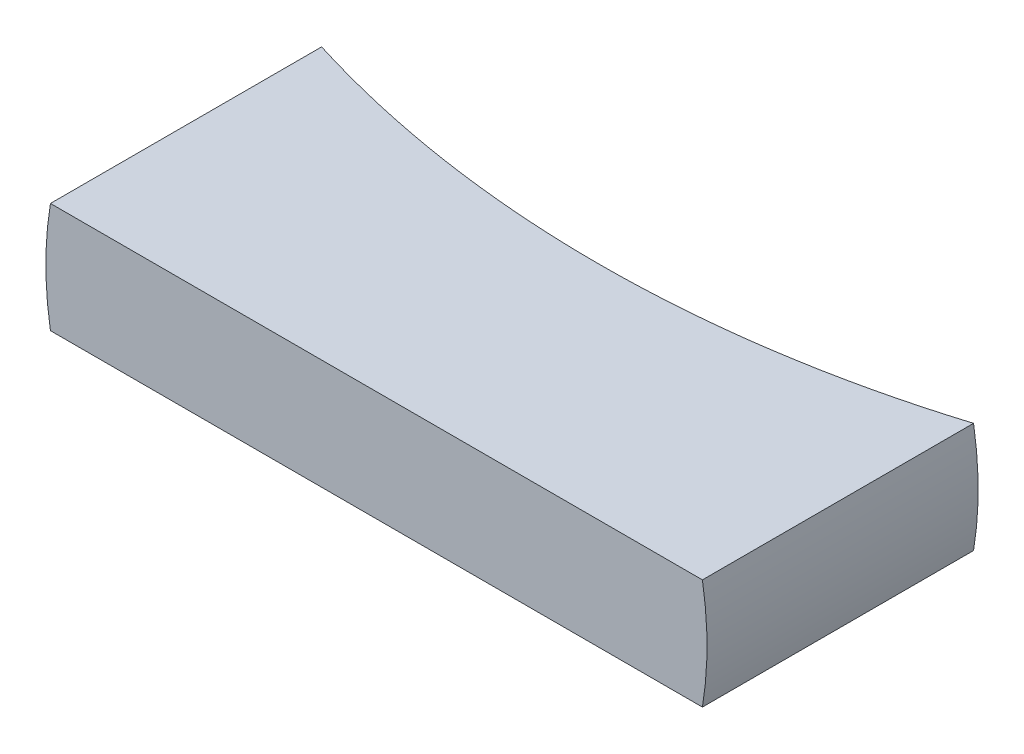
ISO-10303-21;
HEADER;
FILE_DESCRIPTION(('STEP AP214'),'2;1');
FILE_NAME('part.step','',(''),(''),'','','');
FILE_SCHEMA(('AUTOMOTIVE_DESIGN { 1 0 10303 214 1 1 1 1 }'));
ENDSEC;
DATA;
#1=APPLICATION_CONTEXT('core data for automotive mechanical design processes');
#2=APPLICATION_PROTOCOL_DEFINITION('international standard','automotive_design',2000,#1);
#3=PRODUCT_CONTEXT('',#1,'mechanical');
#4=PRODUCT('Part','Part','',(#3));
#5=PRODUCT_RELATED_PRODUCT_CATEGORY('part','',(#4));
#6=PRODUCT_DEFINITION_FORMATION('','',#4);
#7=PRODUCT_DEFINITION_CONTEXT('part definition',#1,'design');
#8=PRODUCT_DEFINITION('design','',#6,#7);
#9=PRODUCT_DEFINITION_SHAPE('','',#8);
#10=(LENGTH_UNIT() NAMED_UNIT(*) SI_UNIT(.MILLI.,.METRE.));
#11=(NAMED_UNIT(*) PLANE_ANGLE_UNIT() SI_UNIT($,.RADIAN.));
#12=(NAMED_UNIT(*) SI_UNIT($,.STERADIAN.) SOLID_ANGLE_UNIT());
#13=UNCERTAINTY_MEASURE_WITH_UNIT(LENGTH_MEASURE(1.E-05),#10,'distance_accuracy_value','');
#14=(GEOMETRIC_REPRESENTATION_CONTEXT(3) GLOBAL_UNCERTAINTY_ASSIGNED_CONTEXT((#13)) GLOBAL_UNIT_ASSIGNED_CONTEXT((#10,
#11,#12)) REPRESENTATION_CONTEXT('',''));
#15=CARTESIAN_POINT('',(0.,0.,0.));
#16=DIRECTION('',(0.,0.,1.));
#17=DIRECTION('',(1.,0.,0.));
#18=AXIS2_PLACEMENT_3D('',#15,#16,#17);
#19=CARTESIAN_POINT('',(0.,0.,12.));
#20=DIRECTION('',(0.,0.,-1.));
#21=DIRECTION('',(-1.,0.,0.));
#22=AXIS2_PLACEMENT_3D('',#19,#20,#21);
#23=CYLINDRICAL_SURFACE('',#22,3.);
#24=CARTESIAN_POINT('',(0.,0.,12.));
#25=DIRECTION('',(0.,0.,1.));
#26=DIRECTION('',(1.,0.,0.));
#27=AXIS2_PLACEMENT_3D('',#24,#25,#26);
#28=CIRCLE('',#27,3.);
#29=CARTESIAN_POINT('',(2.95803989154981,-0.5,12.));
#30=VERTEX_POINT('',#29);
#31=CARTESIAN_POINT('',(2.95803989154981,0.5,12.));
#32=VERTEX_POINT('',#31);
#33=EDGE_CURVE('E103',#30,#32,#28,.T.);
#34=ORIENTED_EDGE('',*,*,#33,.F.);
#35=DIRECTION('',(0.,0.,-1.));
#36=VECTOR('',#35,1.);
#37=CARTESIAN_POINT('',(2.95803989154981,-0.5,12.));
#38=LINE('',#37,#36);
#39=CARTESIAN_POINT('',(2.95803989154981,-0.5,9.53949684260129));
#40=VERTEX_POINT('',#39);
#41=EDGE_CURVE('E104',#30,#40,#38,.T.);
#42=ORIENTED_EDGE('',*,*,#41,.T.);
#43=CARTESIAN_POINT('',(0.,0.,9.53949684260129));
#44=DIRECTION('',(0.,0.,-1.));
#45=DIRECTION('',(-1.,0.,0.));
#46=AXIS2_PLACEMENT_3D('',#43,#44,#45);
#47=CIRCLE('',#46,3.);
#48=CARTESIAN_POINT('',(2.95803989154981,0.5,9.53949684260129));
#49=VERTEX_POINT('',#48);
#50=EDGE_CURVE('E98',#49,#40,#47,.T.);
#51=ORIENTED_EDGE('',*,*,#50,.F.);
#52=DIRECTION('',(0.,0.,-1.));
#53=VECTOR('',#52,1.);
#54=CARTESIAN_POINT('',(2.95803989154981,0.5,12.));
#55=LINE('',#54,#53);
#56=EDGE_CURVE('E63',#49,#32,#55,.F.);
#57=ORIENTED_EDGE('',*,*,#56,.T.);
#58=EDGE_LOOP('',(#34,#42,#51,#57));
#59=FACE_BOUND('',#58,.T.);
#60=ADVANCED_FACE('F40',(#59),#23,.T.);
#61=CARTESIAN_POINT('',(-2.95803989154981,-0.5,9.53949684260129));
#62=VERTEX_POINT('',#61);
#63=CARTESIAN_POINT('',(-2.95803989154981,0.5,9.53949684260129));
#64=VERTEX_POINT('',#63);
#65=EDGE_CURVE('E91',#62,#64,#47,.T.);
#66=ORIENTED_EDGE('',*,*,#65,.F.);
#67=DIRECTION('',(0.,0.,-1.));
#68=VECTOR('',#67,1.);
#69=CARTESIAN_POINT('',(-2.95803989154981,-0.5,12.));
#70=LINE('',#69,#68);
#71=CARTESIAN_POINT('',(-2.95803989154981,-0.5,12.));
#72=VERTEX_POINT('',#71);
#73=EDGE_CURVE('E55',#62,#72,#70,.F.);
#74=ORIENTED_EDGE('',*,*,#73,.T.);
#75=CARTESIAN_POINT('',(-2.95803989154981,0.5,12.));
#76=VERTEX_POINT('',#75);
#77=EDGE_CURVE('E87',#76,#72,#28,.T.);
#78=ORIENTED_EDGE('',*,*,#77,.F.);
#79=DIRECTION('',(0.,0.,-1.));
#80=VECTOR('',#79,1.);
#81=CARTESIAN_POINT('',(-2.95803989154981,0.5,12.));
#82=LINE('',#81,#80);
#83=EDGE_CURVE('E80',#76,#64,#82,.T.);
#84=ORIENTED_EDGE('',*,*,#83,.T.);
#85=EDGE_LOOP('',(#66,#74,#78,#84));
#86=FACE_BOUND('',#85,.T.);
#87=ADVANCED_FACE('F42',(#86),#23,.T.);
#88=CARTESIAN_POINT('',(0.,0.,12.));
#89=DIRECTION('',(0.,0.,1.));
#90=DIRECTION('',(1.,0.,0.));
#91=AXIS2_PLACEMENT_3D('',#88,#89,#90);
#92=PLANE('',#91);
#93=DIRECTION('',(-1.,0.,0.));
#94=VECTOR('',#93,1.);
#95=CARTESIAN_POINT('',(0.,-0.5,12.));
#96=LINE('',#95,#94);
#97=EDGE_CURVE('E99',#30,#72,#96,.T.);
#98=ORIENTED_EDGE('',*,*,#97,.F.);
#99=ORIENTED_EDGE('',*,*,#33,.T.);
#100=DIRECTION('',(1.,0.,0.));
#101=VECTOR('',#100,1.);
#102=CARTESIAN_POINT('',(0.,0.5,12.));
#103=LINE('',#102,#101);
#104=EDGE_CURVE('E94',#76,#32,#103,.T.);
#105=ORIENTED_EDGE('',*,*,#104,.F.);
#106=ORIENTED_EDGE('',*,*,#77,.T.);
#107=EDGE_LOOP('',(#98,#99,#105,#106));
#108=FACE_BOUND('',#107,.T.);
#109=ADVANCED_FACE('F122',(#108),#92,.T.);
#110=CARTESIAN_POINT('',(0.,0.,0.));
#111=DIRECTION('',(0.,0.,1.));
#112=DIRECTION('',(-1.,0.,0.));
#113=AXIS2_PLACEMENT_3D('',#110,#111,#112);
#114=SPHERICAL_SURFACE('',#113,10.0001);
#115=CARTESIAN_POINT('',(0.,-0.5,0.));
#116=DIRECTION('',(0.,1.,0.));
#117=DIRECTION('',(-1.,0.,0.));
#118=AXIS2_PLACEMENT_3D('',#115,#116,#117);
#119=CIRCLE('',#118,9.9875923029527);
#120=EDGE_CURVE('E12',#62,#40,#119,.T.);
#121=ORIENTED_EDGE('',*,*,#120,.F.);
#122=ORIENTED_EDGE('',*,*,#65,.T.);
#123=CARTESIAN_POINT('',(0.,0.5,0.));
#124=DIRECTION('',(0.,-1.,0.));
#125=DIRECTION('',(1.,0.,0.));
#126=AXIS2_PLACEMENT_3D('',#123,#124,#125);
#127=CIRCLE('',#126,9.9875923029527);
#128=EDGE_CURVE('E49',#49,#64,#127,.T.);
#129=ORIENTED_EDGE('',*,*,#128,.F.);
#130=ORIENTED_EDGE('',*,*,#50,.T.);
#131=EDGE_LOOP('',(#121,#122,#129,#130));
#132=FACE_BOUND('',#131,.T.);
#133=ADVANCED_FACE('F96',(#132),#114,.F.);
#134=CARTESIAN_POINT('',(8.71080259259249,0.500000000000001,30.));
#135=DIRECTION('',(0.,-1.,0.));
#136=DIRECTION('',(1.,0.,0.));
#137=AXIS2_PLACEMENT_3D('',#134,#135,#136);
#138=PLANE('',#137);
#139=ORIENTED_EDGE('',*,*,#104,.T.);
#140=ORIENTED_EDGE('',*,*,#56,.F.);
#141=ORIENTED_EDGE('',*,*,#128,.T.);
#142=ORIENTED_EDGE('',*,*,#83,.F.);
#143=EDGE_LOOP('',(#139,#140,#141,#142));
#144=FACE_BOUND('',#143,.T.);
#145=ADVANCED_FACE('F79',(#144),#138,.F.);
#146=CARTESIAN_POINT('',(8.71080259259249,-0.499999999999999,30.));
#147=DIRECTION('',(0.,1.,0.));
#148=DIRECTION('',(-1.,0.,0.));
#149=AXIS2_PLACEMENT_3D('',#146,#147,#148);
#150=PLANE('',#149);
#151=ORIENTED_EDGE('',*,*,#97,.T.);
#152=ORIENTED_EDGE('',*,*,#73,.F.);
#153=ORIENTED_EDGE('',*,*,#120,.T.);
#154=ORIENTED_EDGE('',*,*,#41,.F.);
#155=EDGE_LOOP('',(#151,#152,#153,#154));
#156=FACE_BOUND('',#155,.T.);
#157=ADVANCED_FACE('F123',(#156),#150,.F.);
#158=CLOSED_SHELL('',(#60,#87,#109,#133,#145,#157));
#159=MANIFOLD_SOLID_BREP('B2',#158);
#160=ADVANCED_BREP_SHAPE_REPRESENTATION('',(#18,#159),#14);
#161=SHAPE_DEFINITION_REPRESENTATION(#9,#160);
ENDSEC;
END-ISO-10303-21;
